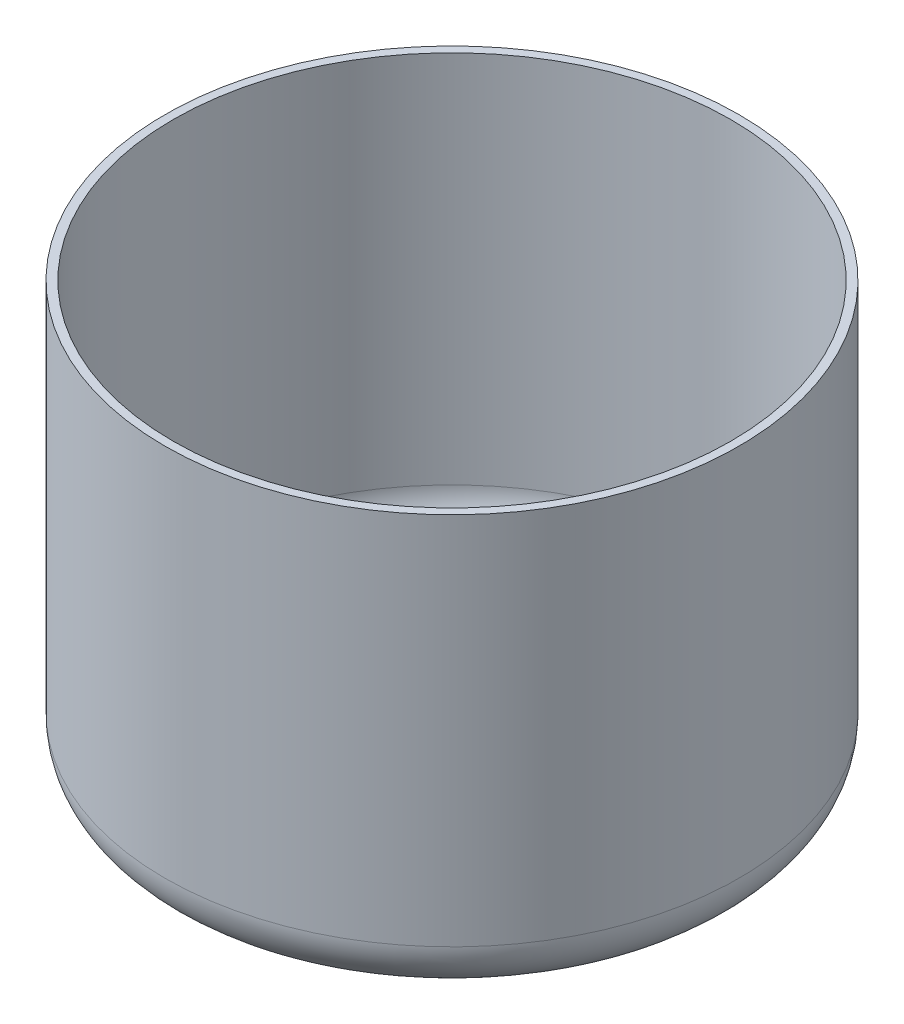
ISO-10303-21;
HEADER;
FILE_DESCRIPTION(('STEP AP214'),'2;1');
FILE_NAME('part.step','',(''),(''),'','','');
FILE_SCHEMA(('AUTOMOTIVE_DESIGN { 1 0 10303 214 1 1 1 1 }'));
ENDSEC;
DATA;
#1=APPLICATION_CONTEXT('core data for automotive mechanical design processes');
#2=APPLICATION_PROTOCOL_DEFINITION('international standard','automotive_design',2000,#1);
#3=PRODUCT_CONTEXT('',#1,'mechanical');
#4=PRODUCT('Part','Part','',(#3));
#5=PRODUCT_RELATED_PRODUCT_CATEGORY('part','',(#4));
#6=PRODUCT_DEFINITION_FORMATION('','',#4);
#7=PRODUCT_DEFINITION_CONTEXT('part definition',#1,'design');
#8=PRODUCT_DEFINITION('design','',#6,#7);
#9=PRODUCT_DEFINITION_SHAPE('','',#8);
#10=(LENGTH_UNIT() NAMED_UNIT(*) SI_UNIT(.MILLI.,.METRE.));
#11=(NAMED_UNIT(*) PLANE_ANGLE_UNIT() SI_UNIT($,.RADIAN.));
#12=(NAMED_UNIT(*) SI_UNIT($,.STERADIAN.) SOLID_ANGLE_UNIT());
#13=UNCERTAINTY_MEASURE_WITH_UNIT(LENGTH_MEASURE(1.E-05),#10,'distance_accuracy_value','');
#14=(GEOMETRIC_REPRESENTATION_CONTEXT(3) GLOBAL_UNCERTAINTY_ASSIGNED_CONTEXT((#13)) GLOBAL_UNIT_ASSIGNED_CONTEXT((#10,
#11,#12)) REPRESENTATION_CONTEXT('',''));
#15=CARTESIAN_POINT('',(0.,0.,0.));
#16=DIRECTION('',(0.,0.,1.));
#17=DIRECTION('',(1.,0.,0.));
#18=AXIS2_PLACEMENT_3D('',#15,#16,#17);
#19=CARTESIAN_POINT('',(0.,190.5,0.));
#20=DIRECTION('',(0.,-1.,0.));
#21=DIRECTION('',(0.,0.,-1.));
#22=AXIS2_PLACEMENT_3D('',#19,#20,#21);
#23=CYLINDRICAL_SURFACE('',#22,130.81);
#24=CARTESIAN_POINT('',(0.,20.,0.));
#25=DIRECTION('',(0.,-1.,0.));
#26=DIRECTION('',(0.,0.,-1.));
#27=AXIS2_PLACEMENT_3D('',#24,#25,#26);
#28=CIRCLE('',#27,130.81);
#29=CARTESIAN_POINT('',(0.,20.,-130.81));
#30=VERTEX_POINT('',#29);
#31=EDGE_CURVE('E49',#30,#30,#28,.F.);
#32=ORIENTED_EDGE('',*,*,#31,.T.);
#33=EDGE_LOOP('',(#32));
#34=FACE_BOUND('',#33,.T.);
#35=CARTESIAN_POINT('',(0.,190.5,0.));
#36=DIRECTION('',(0.,1.,0.));
#37=DIRECTION('',(0.,0.,1.));
#38=AXIS2_PLACEMENT_3D('',#35,#36,#37);
#39=CIRCLE('',#38,130.81);
#40=CARTESIAN_POINT('',(0.,190.5,130.81));
#41=VERTEX_POINT('',#40);
#42=EDGE_CURVE('E45',#41,#41,#39,.T.);
#43=ORIENTED_EDGE('',*,*,#42,.F.);
#44=EDGE_LOOP('',(#43));
#45=FACE_BOUND('',#44,.T.);
#46=ADVANCED_FACE('F41',(#34,#45),#23,.T.);
#47=CARTESIAN_POINT('',(0.,190.5,0.));
#48=DIRECTION('',(0.,1.,0.));
#49=DIRECTION('',(0.,0.,1.));
#50=AXIS2_PLACEMENT_3D('',#47,#48,#49);
#51=PLANE('',#50);
#52=CARTESIAN_POINT('',(0.,190.5,0.));
#53=DIRECTION('',(0.,1.,0.));
#54=DIRECTION('',(0.,0.,1.));
#55=AXIS2_PLACEMENT_3D('',#52,#53,#54);
#56=CIRCLE('',#55,127.);
#57=CARTESIAN_POINT('',(0.,190.5,127.));
#58=VERTEX_POINT('',#57);
#59=EDGE_CURVE('E61',#58,#58,#56,.T.);
#60=ORIENTED_EDGE('',*,*,#59,.F.);
#61=EDGE_LOOP('',(#60));
#62=FACE_BOUND('',#61,.T.);
#63=ORIENTED_EDGE('',*,*,#42,.T.);
#64=EDGE_LOOP('',(#63));
#65=FACE_BOUND('',#64,.T.);
#66=ADVANCED_FACE('F67',(#62,#65),#51,.T.);
#67=CARTESIAN_POINT('',(0.,-3.81,0.));
#68=DIRECTION('',(0.,1.,0.));
#69=DIRECTION('',(0.,0.,1.));
#70=AXIS2_PLACEMENT_3D('',#67,#68,#69);
#71=PLANE('',#70);
#72=CARTESIAN_POINT('',(0.,-3.81000000000001,0.));
#73=DIRECTION('',(0.,1.,0.));
#74=DIRECTION('',(0.,0.,1.));
#75=AXIS2_PLACEMENT_3D('',#72,#73,#74);
#76=CIRCLE('',#75,107.);
#77=CARTESIAN_POINT('',(0.,-3.81000000000001,107.));
#78=VERTEX_POINT('',#77);
#79=EDGE_CURVE('E10',#78,#78,#76,.F.);
#80=ORIENTED_EDGE('',*,*,#79,.T.);
#81=EDGE_LOOP('',(#80));
#82=FACE_BOUND('',#81,.T.);
#83=ADVANCED_FACE('F70',(#82),#71,.F.);
#84=CARTESIAN_POINT('',(0.,20.,0.));
#85=DIRECTION('',(0.,1.,0.));
#86=DIRECTION('',(0.,0.,1.));
#87=AXIS2_PLACEMENT_3D('',#84,#85,#86);
#88=TOROIDAL_SURFACE('',#87,107.,23.81);
#89=ORIENTED_EDGE('',*,*,#79,.F.);
#90=EDGE_LOOP('',(#89));
#91=FACE_BOUND('',#90,.T.);
#92=ORIENTED_EDGE('',*,*,#31,.F.);
#93=EDGE_LOOP('',(#92));
#94=FACE_BOUND('',#93,.T.);
#95=ADVANCED_FACE('F43',(#91,#94),#88,.T.);
#96=CARTESIAN_POINT('',(0.,190.5,0.));
#97=DIRECTION('',(0.,-1.,0.));
#98=DIRECTION('',(0.,0.,-1.));
#99=AXIS2_PLACEMENT_3D('',#96,#97,#98);
#100=CYLINDRICAL_SURFACE('',#99,127.);
#101=CARTESIAN_POINT('',(0.,20.,0.));
#102=DIRECTION('',(0.,1.,0.));
#103=DIRECTION('',(0.,0.,1.));
#104=AXIS2_PLACEMENT_3D('',#101,#102,#103);
#105=CIRCLE('',#104,127.);
#106=CARTESIAN_POINT('',(0.,20.,127.));
#107=VERTEX_POINT('',#106);
#108=EDGE_CURVE('E58',#107,#107,#105,.T.);
#109=ORIENTED_EDGE('',*,*,#108,.F.);
#110=EDGE_LOOP('',(#109));
#111=FACE_BOUND('',#110,.T.);
#112=ORIENTED_EDGE('',*,*,#59,.T.);
#113=EDGE_LOOP('',(#112));
#114=FACE_BOUND('',#113,.T.);
#115=ADVANCED_FACE('F65',(#111,#114),#100,.F.);
#116=CARTESIAN_POINT('',(0.,0.,0.));
#117=DIRECTION('',(0.,1.,0.));
#118=DIRECTION('',(0.,0.,1.));
#119=AXIS2_PLACEMENT_3D('',#116,#117,#118);
#120=PLANE('',#119);
#121=CARTESIAN_POINT('',(0.,0.,0.));
#122=DIRECTION('',(0.,1.,0.));
#123=DIRECTION('',(0.,0.,1.));
#124=AXIS2_PLACEMENT_3D('',#121,#122,#123);
#125=CIRCLE('',#124,107.);
#126=CARTESIAN_POINT('',(0.,0.,107.));
#127=VERTEX_POINT('',#126);
#128=EDGE_CURVE('E55',#127,#127,#125,.F.);
#129=ORIENTED_EDGE('',*,*,#128,.F.);
#130=EDGE_LOOP('',(#129));
#131=FACE_BOUND('',#130,.T.);
#132=ADVANCED_FACE('F89',(#131),#120,.T.);
#133=CARTESIAN_POINT('',(0.,20.,0.));
#134=DIRECTION('',(0.,1.,0.));
#135=DIRECTION('',(0.,0.,1.));
#136=AXIS2_PLACEMENT_3D('',#133,#134,#135);
#137=TOROIDAL_SURFACE('',#136,107.,20.);
#138=ORIENTED_EDGE('',*,*,#128,.T.);
#139=EDGE_LOOP('',(#138));
#140=FACE_BOUND('',#139,.T.);
#141=ORIENTED_EDGE('',*,*,#108,.T.);
#142=EDGE_LOOP('',(#141));
#143=FACE_BOUND('',#142,.T.);
#144=ADVANCED_FACE('F97',(#140,#143),#137,.F.);
#145=CLOSED_SHELL('',(#46,#66,#83,#95,#115,#132,#144));
#146=MANIFOLD_SOLID_BREP('B2',#145);
#147=ADVANCED_BREP_SHAPE_REPRESENTATION('',(#18,#146),#14);
#148=SHAPE_DEFINITION_REPRESENTATION(#9,#147);
ENDSEC;
END-ISO-10303-21;
